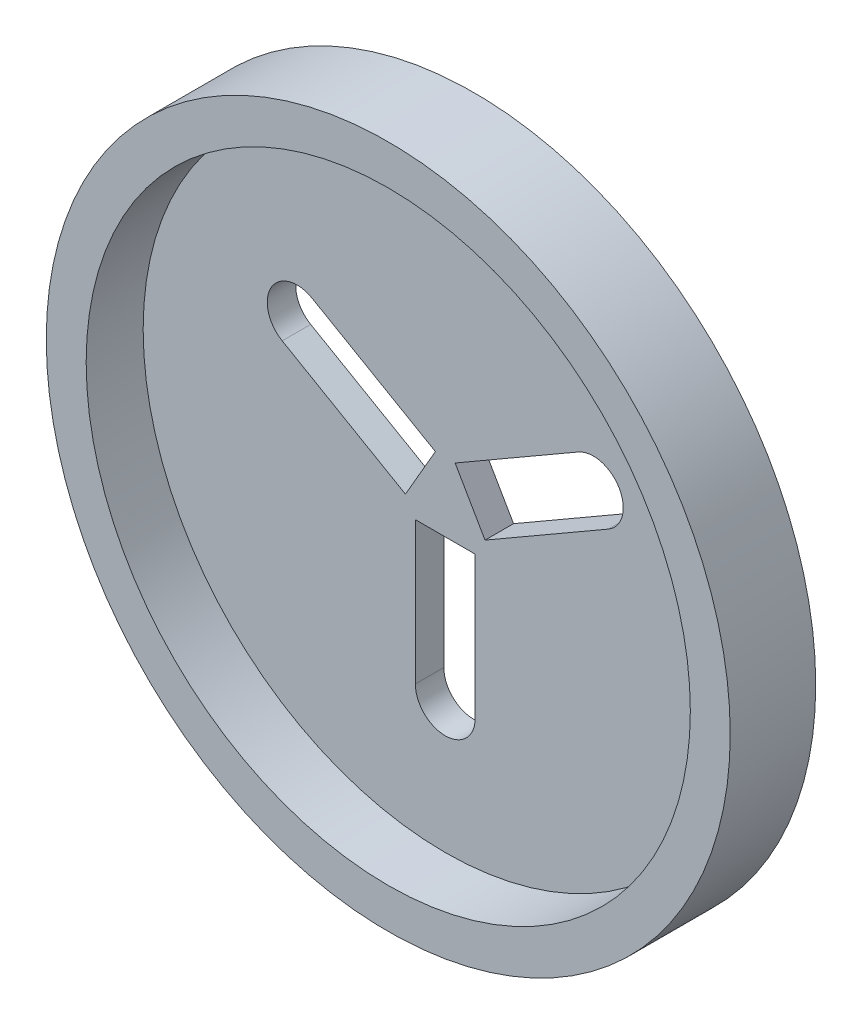
ISO-10303-21;
HEADER;
FILE_DESCRIPTION(('STEP AP214'),'2;1');
FILE_NAME('part.step','',(''),(''),'','','');
FILE_SCHEMA(('AUTOMOTIVE_DESIGN { 1 0 10303 214 1 1 1 1 }'));
ENDSEC;
DATA;
#1=APPLICATION_CONTEXT('core data for automotive mechanical design processes');
#2=APPLICATION_PROTOCOL_DEFINITION('international standard','automotive_design',2000,#1);
#3=PRODUCT_CONTEXT('',#1,'mechanical');
#4=PRODUCT('Part','Part','',(#3));
#5=PRODUCT_RELATED_PRODUCT_CATEGORY('part','',(#4));
#6=PRODUCT_DEFINITION_FORMATION('','',#4);
#7=PRODUCT_DEFINITION_CONTEXT('part definition',#1,'design');
#8=PRODUCT_DEFINITION('design','',#6,#7);
#9=PRODUCT_DEFINITION_SHAPE('','',#8);
#10=(LENGTH_UNIT() NAMED_UNIT(*) SI_UNIT(.MILLI.,.METRE.));
#11=(NAMED_UNIT(*) PLANE_ANGLE_UNIT() SI_UNIT($,.RADIAN.));
#12=(NAMED_UNIT(*) SI_UNIT($,.STERADIAN.) SOLID_ANGLE_UNIT());
#13=UNCERTAINTY_MEASURE_WITH_UNIT(LENGTH_MEASURE(1.E-05),#10,'distance_accuracy_value','');
#14=(GEOMETRIC_REPRESENTATION_CONTEXT(3) GLOBAL_UNCERTAINTY_ASSIGNED_CONTEXT((#13)) GLOBAL_UNIT_ASSIGNED_CONTEXT((#10,
#11,#12)) REPRESENTATION_CONTEXT('',''));
#15=CARTESIAN_POINT('',(0.,0.,0.));
#16=DIRECTION('',(0.,0.,1.));
#17=DIRECTION('',(1.,0.,0.));
#18=AXIS2_PLACEMENT_3D('',#15,#16,#17);
#19=CARTESIAN_POINT('',(0.,0.,5.));
#20=DIRECTION('',(0.,0.,1.));
#21=DIRECTION('',(1.,0.,0.));
#22=AXIS2_PLACEMENT_3D('',#19,#20,#21);
#23=PLANE('',#22);
#24=DIRECTION('',(0.,-1.,0.));
#25=VECTOR('',#24,1.);
#26=CARTESIAN_POINT('',(-5.25,0.,5.));
#27=LINE('',#26,#25);
#28=CARTESIAN_POINT('',(-5.25,-5.03108891324552,5.));
#29=VERTEX_POINT('',#28);
#30=CARTESIAN_POINT('',(-5.25,-30.,5.));
#31=VERTEX_POINT('',#30);
#32=EDGE_CURVE('E199',#29,#31,#27,.T.);
#33=ORIENTED_EDGE('',*,*,#32,.F.);
#34=DIRECTION('',(1.,0.,0.));
#35=VECTOR('',#34,1.);
#36=CARTESIAN_POINT('',(8.71410161513771,-5.03108891324552,5.));
#37=LINE('',#36,#35);
#38=CARTESIAN_POINT('',(5.25,-5.03108891324552,5.));
#39=VERTEX_POINT('',#38);
#40=EDGE_CURVE('E203',#29,#39,#37,.T.);
#41=ORIENTED_EDGE('',*,*,#40,.T.);
#42=DIRECTION('',(0.,-1.,0.));
#43=VECTOR('',#42,1.);
#44=CARTESIAN_POINT('',(5.25,0.,5.));
#45=LINE('',#44,#43);
#46=CARTESIAN_POINT('',(5.25,-30.,5.));
#47=VERTEX_POINT('',#46);
#48=EDGE_CURVE('E264',#39,#47,#45,.T.);
#49=ORIENTED_EDGE('',*,*,#48,.T.);
#50=CARTESIAN_POINT('',(0.,-30.,5.));
#51=DIRECTION('',(0.,0.,1.));
#52=DIRECTION('',(1.,0.,0.));
#53=AXIS2_PLACEMENT_3D('',#50,#51,#52);
#54=CIRCLE('',#53,5.25);
#55=EDGE_CURVE('E206',#31,#47,#54,.T.);
#56=ORIENTED_EDGE('',*,*,#55,.F.);
#57=EDGE_LOOP('',(#33,#41,#49,#56));
#58=FACE_BOUND('',#57,.T.);
#59=DIRECTION('',(-0.866025403784436,0.500000000000004,0.));
#60=VECTOR('',#59,1.);
#61=CARTESIAN_POINT('',(2.62500000000002,4.54663336986829,5.));
#62=LINE('',#61,#60);
#63=CARTESIAN_POINT('',(-1.73205080756883,7.06217782649107,5.));
#64=VERTEX_POINT('',#63);
#65=CARTESIAN_POINT('',(-23.3557621135331,19.5466333698684,5.));
#66=VERTEX_POINT('',#65);
#67=EDGE_CURVE('E272',#64,#66,#62,.T.);
#68=ORIENTED_EDGE('',*,*,#67,.F.);
#69=DIRECTION('',(-0.500000000000004,-0.866025403784436,0.));
#70=VECTOR('',#69,1.);
#71=CARTESIAN_POINT('',(-8.71410161513777,-5.03108891324552,5.));
#72=LINE('',#71,#70);
#73=CARTESIAN_POINT('',(-6.98205080756887,-2.03108891324551,5.));
#74=VERTEX_POINT('',#73);
#75=EDGE_CURVE('E230',#64,#74,#72,.T.);
#76=ORIENTED_EDGE('',*,*,#75,.T.);
#77=DIRECTION('',(-0.866025403784436,0.500000000000004,0.));
#78=VECTOR('',#77,1.);
#79=CARTESIAN_POINT('',(-2.62500000000002,-4.54663336986829,5.));
#80=LINE('',#79,#78);
#81=CARTESIAN_POINT('',(-28.6057621135331,10.4533666301318,5.));
#82=VERTEX_POINT('',#81);
#83=EDGE_CURVE('E128',#74,#82,#80,.T.);
#84=ORIENTED_EDGE('',*,*,#83,.T.);
#85=CARTESIAN_POINT('',(-25.9807621135331,15.0000000000001,5.));
#86=DIRECTION('',(0.,0.,1.));
#87=DIRECTION('',(1.,0.,0.));
#88=AXIS2_PLACEMENT_3D('',#85,#86,#87);
#89=CIRCLE('',#88,5.25);
#90=EDGE_CURVE('E267',#66,#82,#89,.T.);
#91=ORIENTED_EDGE('',*,*,#90,.F.);
#92=EDGE_LOOP('',(#68,#76,#84,#91));
#93=FACE_BOUND('',#92,.T.);
#94=DIRECTION('',(0.866025403784443,0.499999999999992,0.));
#95=VECTOR('',#94,1.);
#96=CARTESIAN_POINT('',(2.62499999999996,-4.54663336986833,5.));
#97=LINE('',#96,#95);
#98=CARTESIAN_POINT('',(6.98205080756889,-2.03108891324558,5.));
#99=VERTEX_POINT('',#98);
#100=CARTESIAN_POINT('',(28.6057621135333,10.4533666301314,5.));
#101=VERTEX_POINT('',#100);
#102=EDGE_CURVE('E290',#99,#101,#97,.T.);
#103=ORIENTED_EDGE('',*,*,#102,.F.);
#104=DIRECTION('',(-0.499999999999996,0.866025403784441,0.));
#105=VECTOR('',#104,1.);
#106=CARTESIAN_POINT('',(0.,10.0621778264911,5.));
#107=LINE('',#106,#105);
#108=CARTESIAN_POINT('',(1.73205080756893,7.06217782649105,5.));
#109=VERTEX_POINT('',#108);
#110=EDGE_CURVE('E227',#99,#109,#107,.T.);
#111=ORIENTED_EDGE('',*,*,#110,.T.);
#112=DIRECTION('',(0.866025403784443,0.499999999999992,0.));
#113=VECTOR('',#112,1.);
#114=CARTESIAN_POINT('',(-2.62499999999996,4.54663336986833,5.));
#115=LINE('',#114,#113);
#116=CARTESIAN_POINT('',(23.3557621135333,19.5466333698681,5.));
#117=VERTEX_POINT('',#116);
#118=EDGE_CURVE('E282',#109,#117,#115,.T.);
#119=ORIENTED_EDGE('',*,*,#118,.T.);
#120=CARTESIAN_POINT('',(25.9807621135333,14.9999999999998,5.));
#121=DIRECTION('',(0.,0.,1.));
#122=DIRECTION('',(1.,0.,0.));
#123=AXIS2_PLACEMENT_3D('',#120,#121,#122);
#124=CIRCLE('',#123,5.25);
#125=EDGE_CURVE('E285',#101,#117,#124,.T.);
#126=ORIENTED_EDGE('',*,*,#125,.F.);
#127=EDGE_LOOP('',(#103,#111,#119,#126));
#128=FACE_BOUND('',#127,.T.);
#129=CARTESIAN_POINT('',(0.,0.,5.));
#130=DIRECTION('',(0.,0.,1.));
#131=DIRECTION('',(1.,0.,0.));
#132=AXIS2_PLACEMENT_3D('',#129,#130,#131);
#133=CIRCLE('',#132,53.);
#134=CARTESIAN_POINT('',(53.,0.,5.));
#135=VERTEX_POINT('',#134);
#136=EDGE_CURVE('E260',#135,#135,#133,.T.);
#137=ORIENTED_EDGE('',*,*,#136,.T.);
#138=EDGE_LOOP('',(#137));
#139=FACE_BOUND('',#138,.T.);
#140=ADVANCED_FACE('F112',(#58,#93,#128,#139),#23,.T.);
#141=CARTESIAN_POINT('',(0.,0.,0.));
#142=DIRECTION('',(0.,0.,1.));
#143=DIRECTION('',(1.,0.,0.));
#144=AXIS2_PLACEMENT_3D('',#141,#142,#143);
#145=PLANE('',#144);
#146=DIRECTION('',(1.,0.,0.));
#147=VECTOR('',#146,1.);
#148=CARTESIAN_POINT('',(8.71410161513771,-5.03108891324552,0.));
#149=LINE('',#148,#147);
#150=CARTESIAN_POINT('',(-5.25,-5.03108891324552,0.));
#151=VERTEX_POINT('',#150);
#152=CARTESIAN_POINT('',(5.25,-5.03108891324552,0.));
#153=VERTEX_POINT('',#152);
#154=EDGE_CURVE('E239',#151,#153,#149,.T.);
#155=ORIENTED_EDGE('',*,*,#154,.F.);
#156=DIRECTION('',(0.,-1.,0.));
#157=VECTOR('',#156,1.);
#158=CARTESIAN_POINT('',(-5.25,0.,0.));
#159=LINE('',#158,#157);
#160=CARTESIAN_POINT('',(-5.25,-30.,0.));
#161=VERTEX_POINT('',#160);
#162=EDGE_CURVE('E216',#151,#161,#159,.T.);
#163=ORIENTED_EDGE('',*,*,#162,.T.);
#164=CARTESIAN_POINT('',(0.,-30.,0.));
#165=DIRECTION('',(0.,0.,1.));
#166=DIRECTION('',(1.,0.,0.));
#167=AXIS2_PLACEMENT_3D('',#164,#165,#166);
#168=CIRCLE('',#167,5.25);
#169=CARTESIAN_POINT('',(5.25,-30.,0.));
#170=VERTEX_POINT('',#169);
#171=EDGE_CURVE('E311',#161,#170,#168,.T.);
#172=ORIENTED_EDGE('',*,*,#171,.T.);
#173=DIRECTION('',(0.,-1.,0.));
#174=VECTOR('',#173,1.);
#175=CARTESIAN_POINT('',(5.25,0.,0.));
#176=LINE('',#175,#174);
#177=EDGE_CURVE('E315',#153,#170,#176,.T.);
#178=ORIENTED_EDGE('',*,*,#177,.F.);
#179=EDGE_LOOP('',(#155,#163,#172,#178));
#180=FACE_BOUND('',#179,.T.);
#181=DIRECTION('',(-0.500000000000004,-0.866025403784436,0.));
#182=VECTOR('',#181,1.);
#183=CARTESIAN_POINT('',(-8.71410161513777,-5.03108891324552,0.));
#184=LINE('',#183,#182);
#185=CARTESIAN_POINT('',(-1.73205080756883,7.06217782649107,0.));
#186=VERTEX_POINT('',#185);
#187=CARTESIAN_POINT('',(-6.98205080756888,-2.03108891324551,0.));
#188=VERTEX_POINT('',#187);
#189=EDGE_CURVE('E233',#186,#188,#184,.T.);
#190=ORIENTED_EDGE('',*,*,#189,.F.);
#191=DIRECTION('',(-0.866025403784436,0.500000000000004,0.));
#192=VECTOR('',#191,1.);
#193=CARTESIAN_POINT('',(2.62500000000002,4.54663336986829,0.));
#194=LINE('',#193,#192);
#195=CARTESIAN_POINT('',(-23.3557621135331,19.5466333698684,0.));
#196=VERTEX_POINT('',#195);
#197=EDGE_CURVE('E328',#186,#196,#194,.T.);
#198=ORIENTED_EDGE('',*,*,#197,.T.);
#199=CARTESIAN_POINT('',(-25.9807621135331,15.0000000000001,0.));
#200=DIRECTION('',(0.,0.,1.));
#201=DIRECTION('',(1.,0.,0.));
#202=AXIS2_PLACEMENT_3D('',#199,#200,#201);
#203=CIRCLE('',#202,5.25);
#204=CARTESIAN_POINT('',(-28.6057621135331,10.4533666301318,0.));
#205=VERTEX_POINT('',#204);
#206=EDGE_CURVE('E331',#196,#205,#203,.T.);
#207=ORIENTED_EDGE('',*,*,#206,.T.);
#208=DIRECTION('',(-0.866025403784436,0.500000000000004,0.));
#209=VECTOR('',#208,1.);
#210=CARTESIAN_POINT('',(-2.62500000000002,-4.54663336986829,0.));
#211=LINE('',#210,#209);
#212=EDGE_CURVE('E220',#188,#205,#211,.T.);
#213=ORIENTED_EDGE('',*,*,#212,.F.);
#214=EDGE_LOOP('',(#190,#198,#207,#213));
#215=FACE_BOUND('',#214,.T.);
#216=DIRECTION('',(-0.499999999999996,0.866025403784441,0.));
#217=VECTOR('',#216,1.);
#218=CARTESIAN_POINT('',(0.,10.0621778264911,0.));
#219=LINE('',#218,#217);
#220=CARTESIAN_POINT('',(6.98205080756889,-2.03108891324558,0.));
#221=VERTEX_POINT('',#220);
#222=CARTESIAN_POINT('',(1.73205080756893,7.06217782649105,0.));
#223=VERTEX_POINT('',#222);
#224=EDGE_CURVE('E356',#221,#223,#219,.T.);
#225=ORIENTED_EDGE('',*,*,#224,.F.);
#226=DIRECTION('',(0.866025403784443,0.499999999999992,0.));
#227=VECTOR('',#226,1.);
#228=CARTESIAN_POINT('',(2.62499999999996,-4.54663336986833,0.));
#229=LINE('',#228,#227);
#230=CARTESIAN_POINT('',(28.6057621135333,10.4533666301314,0.));
#231=VERTEX_POINT('',#230);
#232=EDGE_CURVE('E318',#221,#231,#229,.T.);
#233=ORIENTED_EDGE('',*,*,#232,.T.);
#234=CARTESIAN_POINT('',(25.9807621135333,14.9999999999998,0.));
#235=DIRECTION('',(0.,0.,1.));
#236=DIRECTION('',(1.,0.,0.));
#237=AXIS2_PLACEMENT_3D('',#234,#235,#236);
#238=CIRCLE('',#237,5.25);
#239=CARTESIAN_POINT('',(23.3557621135333,19.5466333698681,0.));
#240=VERTEX_POINT('',#239);
#241=EDGE_CURVE('E321',#231,#240,#238,.T.);
#242=ORIENTED_EDGE('',*,*,#241,.T.);
#243=DIRECTION('',(0.866025403784443,0.499999999999992,0.));
#244=VECTOR('',#243,1.);
#245=CARTESIAN_POINT('',(-2.62499999999996,4.54663336986833,0.));
#246=LINE('',#245,#244);
#247=EDGE_CURVE('E325',#223,#240,#246,.T.);
#248=ORIENTED_EDGE('',*,*,#247,.F.);
#249=EDGE_LOOP('',(#225,#233,#242,#248));
#250=FACE_BOUND('',#249,.T.);
#251=CARTESIAN_POINT('',(0.,0.,0.));
#252=DIRECTION('',(0.,0.,1.));
#253=DIRECTION('',(1.,0.,0.));
#254=AXIS2_PLACEMENT_3D('',#251,#252,#253);
#255=CIRCLE('',#254,60.);
#256=CARTESIAN_POINT('',(60.,0.,0.));
#257=VERTEX_POINT('',#256);
#258=EDGE_CURVE('E256',#257,#257,#255,.T.);
#259=ORIENTED_EDGE('',*,*,#258,.F.);
#260=EDGE_LOOP('',(#259));
#261=FACE_BOUND('',#260,.T.);
#262=ADVANCED_FACE('F114',(#180,#215,#250,#261),#145,.F.);
#263=CARTESIAN_POINT('',(-2.62500000000002,-4.54663336986829,-5.));
#264=DIRECTION('',(0.500000000000004,0.866025403784436,0.));
#265=DIRECTION('',(-0.866025403784436,0.500000000000004,0.));
#266=AXIS2_PLACEMENT_3D('',#263,#264,#265);
#267=PLANE('',#266);
#268=DIRECTION('',(0.,0.,1.));
#269=VECTOR('',#268,1.);
#270=CARTESIAN_POINT('',(-6.98205080756887,-2.03108891324551,-5.));
#271=LINE('',#270,#269);
#272=EDGE_CURVE('E132',#188,#74,#271,.T.);
#273=ORIENTED_EDGE('',*,*,#272,.F.);
#274=ORIENTED_EDGE('',*,*,#212,.T.);
#275=DIRECTION('',(0.,0.,1.));
#276=VECTOR('',#275,1.);
#277=CARTESIAN_POINT('',(-28.6057621135331,10.4533666301318,-5.));
#278=LINE('',#277,#276);
#279=EDGE_CURVE('E279',#205,#82,#278,.T.);
#280=ORIENTED_EDGE('',*,*,#279,.T.);
#281=ORIENTED_EDGE('',*,*,#83,.F.);
#282=EDGE_LOOP('',(#273,#274,#280,#281));
#283=FACE_BOUND('',#282,.T.);
#284=ADVANCED_FACE('F385',(#283),#267,.T.);
#285=CARTESIAN_POINT('',(-25.9807621135331,15.0000000000001,-5.));
#286=DIRECTION('',(0.,0.,1.));
#287=DIRECTION('',(1.,0.,0.));
#288=AXIS2_PLACEMENT_3D('',#285,#286,#287);
#289=CYLINDRICAL_SURFACE('',#288,5.25);
#290=DIRECTION('',(0.,0.,1.));
#291=VECTOR('',#290,1.);
#292=CARTESIAN_POINT('',(-23.3557621135331,19.5466333698684,-5.));
#293=LINE('',#292,#291);
#294=EDGE_CURVE('E275',#196,#66,#293,.T.);
#295=ORIENTED_EDGE('',*,*,#294,.T.);
#296=ORIENTED_EDGE('',*,*,#90,.T.);
#297=ORIENTED_EDGE('',*,*,#279,.F.);
#298=ORIENTED_EDGE('',*,*,#206,.F.);
#299=EDGE_LOOP('',(#295,#296,#297,#298));
#300=FACE_BOUND('',#299,.T.);
#301=ADVANCED_FACE('F389',(#300),#289,.F.);
#302=CARTESIAN_POINT('',(2.62500000000002,4.54663336986829,-5.));
#303=DIRECTION('',(0.500000000000004,0.866025403784436,0.));
#304=DIRECTION('',(-0.866025403784436,0.500000000000004,0.));
#305=AXIS2_PLACEMENT_3D('',#302,#303,#304);
#306=PLANE('',#305);
#307=ORIENTED_EDGE('',*,*,#197,.F.);
#308=DIRECTION('',(0.,0.,1.));
#309=VECTOR('',#308,1.);
#310=CARTESIAN_POINT('',(-1.73205080756883,7.06217782649107,-5.));
#311=LINE('',#310,#309);
#312=EDGE_CURVE('E12',#186,#64,#311,.T.);
#313=ORIENTED_EDGE('',*,*,#312,.T.);
#314=ORIENTED_EDGE('',*,*,#67,.T.);
#315=ORIENTED_EDGE('',*,*,#294,.F.);
#316=EDGE_LOOP('',(#307,#313,#314,#315));
#317=FACE_BOUND('',#316,.T.);
#318=ADVANCED_FACE('F394',(#317),#306,.F.);
#319=CARTESIAN_POINT('',(-2.62499999999996,4.54663336986833,-5.));
#320=DIRECTION('',(0.499999999999992,-0.866025403784443,0.));
#321=DIRECTION('',(0.866025403784443,0.499999999999992,0.));
#322=AXIS2_PLACEMENT_3D('',#319,#320,#321);
#323=PLANE('',#322);
#324=DIRECTION('',(0.,0.,1.));
#325=VECTOR('',#324,1.);
#326=CARTESIAN_POINT('',(1.73205080756893,7.06217782649105,-5.));
#327=LINE('',#326,#325);
#328=EDGE_CURVE('E242',#223,#109,#327,.T.);
#329=ORIENTED_EDGE('',*,*,#328,.F.);
#330=ORIENTED_EDGE('',*,*,#247,.T.);
#331=DIRECTION('',(0.,0.,1.));
#332=VECTOR('',#331,1.);
#333=CARTESIAN_POINT('',(23.3557621135333,19.5466333698681,-5.));
#334=LINE('',#333,#332);
#335=EDGE_CURVE('E268',#240,#117,#334,.T.);
#336=ORIENTED_EDGE('',*,*,#335,.T.);
#337=ORIENTED_EDGE('',*,*,#118,.F.);
#338=EDGE_LOOP('',(#329,#330,#336,#337));
#339=FACE_BOUND('',#338,.T.);
#340=ADVANCED_FACE('F403',(#339),#323,.T.);
#341=CARTESIAN_POINT('',(25.9807621135333,14.9999999999998,-5.));
#342=DIRECTION('',(0.,0.,1.));
#343=DIRECTION('',(1.,0.,0.));
#344=AXIS2_PLACEMENT_3D('',#341,#342,#343);
#345=CYLINDRICAL_SURFACE('',#344,5.25);
#346=DIRECTION('',(0.,0.,1.));
#347=VECTOR('',#346,1.);
#348=CARTESIAN_POINT('',(28.6057621135333,10.4533666301314,-5.));
#349=LINE('',#348,#347);
#350=EDGE_CURVE('E293',#231,#101,#349,.T.);
#351=ORIENTED_EDGE('',*,*,#350,.T.);
#352=ORIENTED_EDGE('',*,*,#125,.T.);
#353=ORIENTED_EDGE('',*,*,#335,.F.);
#354=ORIENTED_EDGE('',*,*,#241,.F.);
#355=EDGE_LOOP('',(#351,#352,#353,#354));
#356=FACE_BOUND('',#355,.T.);
#357=ADVANCED_FACE('F351',(#356),#345,.F.);
#358=CARTESIAN_POINT('',(2.62499999999996,-4.54663336986833,-5.));
#359=DIRECTION('',(0.499999999999992,-0.866025403784443,0.));
#360=DIRECTION('',(0.866025403784443,0.499999999999992,0.));
#361=AXIS2_PLACEMENT_3D('',#358,#359,#360);
#362=PLANE('',#361);
#363=ORIENTED_EDGE('',*,*,#232,.F.);
#364=DIRECTION('',(0.,0.,1.));
#365=VECTOR('',#364,1.);
#366=CARTESIAN_POINT('',(6.98205080756889,-2.03108891324558,-5.));
#367=LINE('',#366,#365);
#368=EDGE_CURVE('E121',#221,#99,#367,.T.);
#369=ORIENTED_EDGE('',*,*,#368,.T.);
#370=ORIENTED_EDGE('',*,*,#102,.T.);
#371=ORIENTED_EDGE('',*,*,#350,.F.);
#372=EDGE_LOOP('',(#363,#369,#370,#371));
#373=FACE_BOUND('',#372,.T.);
#374=ADVANCED_FACE('F341',(#373),#362,.F.);
#375=CARTESIAN_POINT('',(5.25,0.,-5.));
#376=DIRECTION('',(-1.,0.,0.));
#377=DIRECTION('',(0.,0.,1.));
#378=AXIS2_PLACEMENT_3D('',#375,#376,#377);
#379=PLANE('',#378);
#380=DIRECTION('',(0.,0.,1.));
#381=VECTOR('',#380,1.);
#382=CARTESIAN_POINT('',(5.25,-5.03108891324552,-5.));
#383=LINE('',#382,#381);
#384=EDGE_CURVE('E224',#153,#39,#383,.T.);
#385=ORIENTED_EDGE('',*,*,#384,.F.);
#386=ORIENTED_EDGE('',*,*,#177,.T.);
#387=DIRECTION('',(0.,0.,1.));
#388=VECTOR('',#387,1.);
#389=CARTESIAN_POINT('',(5.25,-30.,-5.));
#390=LINE('',#389,#388);
#391=EDGE_CURVE('E286',#170,#47,#390,.T.);
#392=ORIENTED_EDGE('',*,*,#391,.T.);
#393=ORIENTED_EDGE('',*,*,#48,.F.);
#394=EDGE_LOOP('',(#385,#386,#392,#393));
#395=FACE_BOUND('',#394,.T.);
#396=ADVANCED_FACE('F366',(#395),#379,.T.);
#397=CARTESIAN_POINT('',(0.,-30.,-5.));
#398=DIRECTION('',(0.,0.,1.));
#399=DIRECTION('',(1.,0.,0.));
#400=AXIS2_PLACEMENT_3D('',#397,#398,#399);
#401=CYLINDRICAL_SURFACE('',#400,5.25);
#402=DIRECTION('',(0.,0.,1.));
#403=VECTOR('',#402,1.);
#404=CARTESIAN_POINT('',(-5.25,-30.,-5.));
#405=LINE('',#404,#403);
#406=EDGE_CURVE('E211',#161,#31,#405,.T.);
#407=ORIENTED_EDGE('',*,*,#406,.T.);
#408=ORIENTED_EDGE('',*,*,#55,.T.);
#409=ORIENTED_EDGE('',*,*,#391,.F.);
#410=ORIENTED_EDGE('',*,*,#171,.F.);
#411=EDGE_LOOP('',(#407,#408,#409,#410));
#412=FACE_BOUND('',#411,.T.);
#413=ADVANCED_FACE('F371',(#412),#401,.F.);
#414=CARTESIAN_POINT('',(-5.25,0.,-5.));
#415=DIRECTION('',(-1.,0.,0.));
#416=DIRECTION('',(0.,-1.,0.));
#417=AXIS2_PLACEMENT_3D('',#414,#415,#416);
#418=PLANE('',#417);
#419=ORIENTED_EDGE('',*,*,#162,.F.);
#420=DIRECTION('',(0.,0.,1.));
#421=VECTOR('',#420,1.);
#422=CARTESIAN_POINT('',(-5.25,-5.03108891324552,-5.));
#423=LINE('',#422,#421);
#424=EDGE_CURVE('E214',#151,#29,#423,.T.);
#425=ORIENTED_EDGE('',*,*,#424,.T.);
#426=ORIENTED_EDGE('',*,*,#32,.T.);
#427=ORIENTED_EDGE('',*,*,#406,.F.);
#428=EDGE_LOOP('',(#419,#425,#426,#427));
#429=FACE_BOUND('',#428,.T.);
#430=ADVANCED_FACE('F215',(#429),#418,.F.);
#431=CARTESIAN_POINT('',(0.,0.,0.));
#432=DIRECTION('',(0.,0.,1.));
#433=DIRECTION('',(1.,0.,0.));
#434=AXIS2_PLACEMENT_3D('',#431,#432,#433);
#435=CYLINDRICAL_SURFACE('',#434,53.);
#436=ORIENTED_EDGE('',*,*,#136,.F.);
#437=EDGE_LOOP('',(#436));
#438=FACE_BOUND('',#437,.T.);
#439=CARTESIAN_POINT('',(0.,0.,15.));
#440=DIRECTION('',(0.,0.,1.));
#441=DIRECTION('',(1.,0.,0.));
#442=AXIS2_PLACEMENT_3D('',#439,#440,#441);
#443=CIRCLE('',#442,53.);
#444=CARTESIAN_POINT('',(53.,0.,15.));
#445=VERTEX_POINT('',#444);
#446=EDGE_CURVE('E248',#445,#445,#443,.T.);
#447=ORIENTED_EDGE('',*,*,#446,.T.);
#448=EDGE_LOOP('',(#447));
#449=FACE_BOUND('',#448,.T.);
#450=ADVANCED_FACE('F378',(#438,#449),#435,.F.);
#451=CARTESIAN_POINT('',(0.,0.,0.));
#452=DIRECTION('',(0.,0.,1.));
#453=DIRECTION('',(1.,0.,0.));
#454=AXIS2_PLACEMENT_3D('',#451,#452,#453);
#455=CYLINDRICAL_SURFACE('',#454,60.);
#456=ORIENTED_EDGE('',*,*,#258,.T.);
#457=EDGE_LOOP('',(#456));
#458=FACE_BOUND('',#457,.T.);
#459=CARTESIAN_POINT('',(0.,0.,15.));
#460=DIRECTION('',(0.,0.,1.));
#461=DIRECTION('',(1.,0.,0.));
#462=AXIS2_PLACEMENT_3D('',#459,#460,#461);
#463=CIRCLE('',#462,60.);
#464=CARTESIAN_POINT('',(60.,0.,15.));
#465=VERTEX_POINT('',#464);
#466=EDGE_CURVE('E252',#465,#465,#463,.T.);
#467=ORIENTED_EDGE('',*,*,#466,.F.);
#468=EDGE_LOOP('',(#467));
#469=FACE_BOUND('',#468,.T.);
#470=ADVANCED_FACE('F425',(#458,#469),#455,.T.);
#471=CARTESIAN_POINT('',(0.,0.,15.));
#472=DIRECTION('',(0.,0.,1.));
#473=DIRECTION('',(1.,0.,0.));
#474=AXIS2_PLACEMENT_3D('',#471,#472,#473);
#475=PLANE('',#474);
#476=ORIENTED_EDGE('',*,*,#446,.F.);
#477=EDGE_LOOP('',(#476));
#478=FACE_BOUND('',#477,.T.);
#479=ORIENTED_EDGE('',*,*,#466,.T.);
#480=EDGE_LOOP('',(#479));
#481=FACE_BOUND('',#480,.T.);
#482=ADVANCED_FACE('F419',(#478,#481),#475,.T.);
#483=CARTESIAN_POINT('',(-8.71410161513777,-5.03108891324552,0.));
#484=DIRECTION('',(-0.866025403784436,0.500000000000004,0.));
#485=DIRECTION('',(-0.500000000000004,-0.866025403784436,0.));
#486=AXIS2_PLACEMENT_3D('',#483,#484,#485);
#487=PLANE('',#486);
#488=ORIENTED_EDGE('',*,*,#189,.T.);
#489=ORIENTED_EDGE('',*,*,#272,.T.);
#490=ORIENTED_EDGE('',*,*,#75,.F.);
#491=ORIENTED_EDGE('',*,*,#312,.F.);
#492=EDGE_LOOP('',(#488,#489,#490,#491));
#493=FACE_BOUND('',#492,.T.);
#494=ADVANCED_FACE('F412',(#493),#487,.T.);
#495=CARTESIAN_POINT('',(0.,10.0621778264911,0.));
#496=DIRECTION('',(0.866025403784441,0.499999999999996,0.));
#497=DIRECTION('',(-0.499999999999996,0.866025403784441,0.));
#498=AXIS2_PLACEMENT_3D('',#495,#496,#497);
#499=PLANE('',#498);
#500=ORIENTED_EDGE('',*,*,#224,.T.);
#501=ORIENTED_EDGE('',*,*,#328,.T.);
#502=ORIENTED_EDGE('',*,*,#110,.F.);
#503=ORIENTED_EDGE('',*,*,#368,.F.);
#504=EDGE_LOOP('',(#500,#501,#502,#503));
#505=FACE_BOUND('',#504,.T.);
#506=ADVANCED_FACE('F410',(#505),#499,.T.);
#507=CARTESIAN_POINT('',(8.71410161513771,-5.03108891324552,0.));
#508=DIRECTION('',(0.,-1.,0.));
#509=DIRECTION('',(1.,0.,0.));
#510=AXIS2_PLACEMENT_3D('',#507,#508,#509);
#511=PLANE('',#510);
#512=ORIENTED_EDGE('',*,*,#154,.T.);
#513=ORIENTED_EDGE('',*,*,#384,.T.);
#514=ORIENTED_EDGE('',*,*,#40,.F.);
#515=ORIENTED_EDGE('',*,*,#424,.F.);
#516=EDGE_LOOP('',(#512,#513,#514,#515));
#517=FACE_BOUND('',#516,.T.);
#518=ADVANCED_FACE('F222',(#517),#511,.T.);
#519=CLOSED_SHELL('',(#140,#262,#284,#301,#318,#340,#357,#374,#396,#413,#430,#450,#470,#482,
#494,#506,#518));
#520=MANIFOLD_SOLID_BREP('B2',#519);
#521=ADVANCED_BREP_SHAPE_REPRESENTATION('',(#18,#520),#14);
#522=SHAPE_DEFINITION_REPRESENTATION(#9,#521);
ENDSEC;
END-ISO-10303-21;
